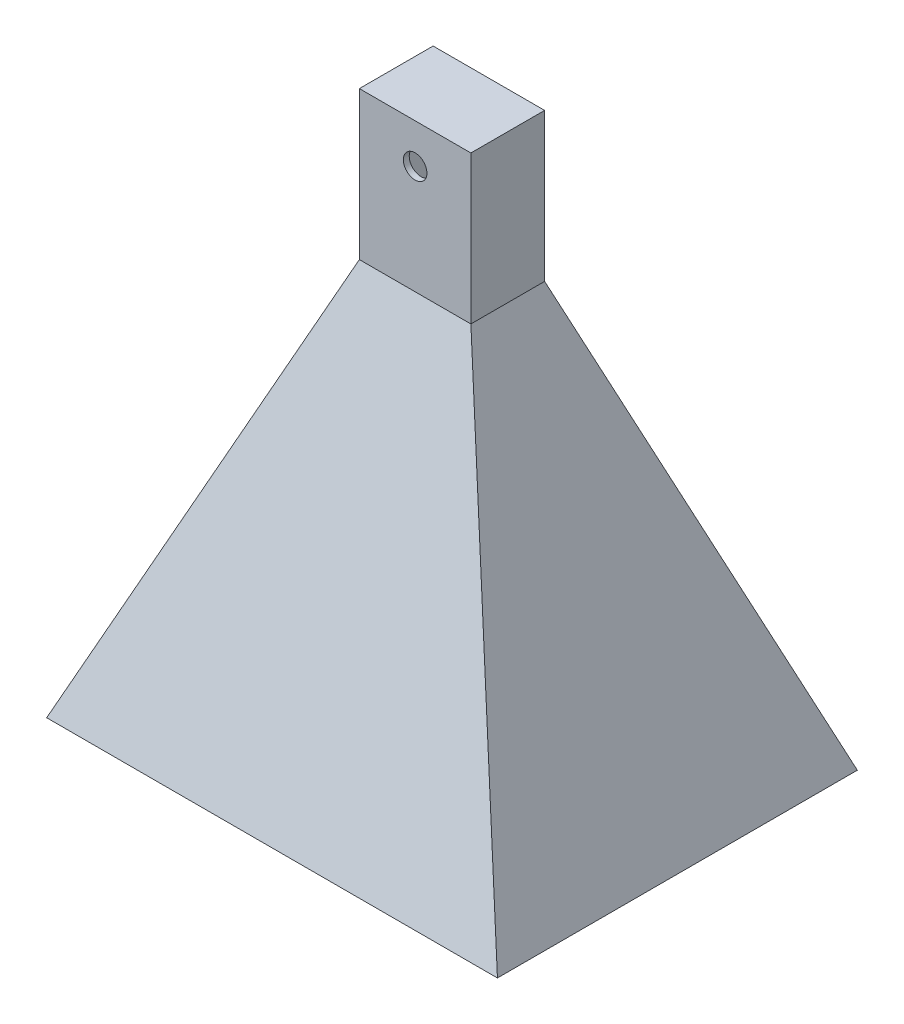
ISO-10303-21;
HEADER;
FILE_DESCRIPTION(('STEP AP214'),'2;1');
FILE_NAME('part.step','',(''),(''),'','','');
FILE_SCHEMA(('AUTOMOTIVE_DESIGN { 1 0 10303 214 1 1 1 1 }'));
ENDSEC;
DATA;
#1=APPLICATION_CONTEXT('core data for automotive mechanical design processes');
#2=APPLICATION_PROTOCOL_DEFINITION('international standard','automotive_design',2000,#1);
#3=PRODUCT_CONTEXT('',#1,'mechanical');
#4=PRODUCT('Part','Part','',(#3));
#5=PRODUCT_RELATED_PRODUCT_CATEGORY('part','',(#4));
#6=PRODUCT_DEFINITION_FORMATION('','',#4);
#7=PRODUCT_DEFINITION_CONTEXT('part definition',#1,'design');
#8=PRODUCT_DEFINITION('design','',#6,#7);
#9=PRODUCT_DEFINITION_SHAPE('','',#8);
#10=(LENGTH_UNIT() NAMED_UNIT(*) SI_UNIT(.MILLI.,.METRE.));
#11=(NAMED_UNIT(*) PLANE_ANGLE_UNIT() SI_UNIT($,.RADIAN.));
#12=(NAMED_UNIT(*) SI_UNIT($,.STERADIAN.) SOLID_ANGLE_UNIT());
#13=UNCERTAINTY_MEASURE_WITH_UNIT(LENGTH_MEASURE(1.E-05),#10,'distance_accuracy_value','');
#14=(GEOMETRIC_REPRESENTATION_CONTEXT(3) GLOBAL_UNCERTAINTY_ASSIGNED_CONTEXT((#13)) GLOBAL_UNIT_ASSIGNED_CONTEXT((#10,
#11,#12)) REPRESENTATION_CONTEXT('',''));
#15=CARTESIAN_POINT('',(0.,0.,0.));
#16=DIRECTION('',(0.,0.,1.));
#17=DIRECTION('',(1.,0.,0.));
#18=AXIS2_PLACEMENT_3D('',#15,#16,#17);
#19=CARTESIAN_POINT('',(0.,695.,0.));
#20=DIRECTION('',(0.,1.,0.));
#21=DIRECTION('',(0.,0.,1.));
#22=AXIS2_PLACEMENT_3D('',#19,#20,#21);
#23=PLANE('',#22);
#24=DIRECTION('',(-1.,0.,0.));
#25=VECTOR('',#24,1.);
#26=CARTESIAN_POINT('',(84.5,695.,52.5000000000001));
#27=LINE('',#26,#25);
#28=CARTESIAN_POINT('',(84.5,695.,52.5000000000001));
#29=VERTEX_POINT('',#28);
#30=CARTESIAN_POINT('',(-84.5,695.,52.5000000000001));
#31=VERTEX_POINT('',#30);
#32=EDGE_CURVE('E267',#29,#31,#27,.T.);
#33=ORIENTED_EDGE('',*,*,#32,.T.);
#34=DIRECTION('',(0.,0.,-1.));
#35=VECTOR('',#34,1.);
#36=CARTESIAN_POINT('',(-84.5,695.,52.5000000000001));
#37=LINE('',#36,#35);
#38=CARTESIAN_POINT('',(-84.5,695.,-52.4999999999999));
#39=VERTEX_POINT('',#38);
#40=EDGE_CURVE('E63',#31,#39,#37,.T.);
#41=ORIENTED_EDGE('',*,*,#40,.T.);
#42=DIRECTION('',(1.,0.,0.));
#43=VECTOR('',#42,1.);
#44=CARTESIAN_POINT('',(-84.5,695.,-52.4999999999999));
#45=LINE('',#44,#43);
#46=CARTESIAN_POINT('',(84.4999999999999,695.,-52.4999999999999));
#47=VERTEX_POINT('',#46);
#48=EDGE_CURVE('E268',#39,#47,#45,.T.);
#49=ORIENTED_EDGE('',*,*,#48,.T.);
#50=DIRECTION('',(0.,0.,1.));
#51=VECTOR('',#50,1.);
#52=CARTESIAN_POINT('',(84.5,695.,-52.4999999999999));
#53=LINE('',#52,#51);
#54=EDGE_CURVE('E265',#47,#29,#53,.T.);
#55=ORIENTED_EDGE('',*,*,#54,.T.);
#56=EDGE_LOOP('',(#33,#41,#49,#55));
#57=FACE_BOUND('',#56,.T.);
#58=DIRECTION('',(1.,0.,0.));
#59=VECTOR('',#58,1.);
#60=CARTESIAN_POINT('',(-94.5,695.,62.5000000000001));
#61=LINE('',#60,#59);
#62=CARTESIAN_POINT('',(-94.5,695.,62.5000000000001));
#63=VERTEX_POINT('',#62);
#64=CARTESIAN_POINT('',(94.5,695.,62.5000000000001));
#65=VERTEX_POINT('',#64);
#66=EDGE_CURVE('E234',#63,#65,#61,.T.);
#67=ORIENTED_EDGE('',*,*,#66,.T.);
#68=DIRECTION('',(0.,0.,-1.));
#69=VECTOR('',#68,1.);
#70=CARTESIAN_POINT('',(94.5,695.,62.5000000000001));
#71=LINE('',#70,#69);
#72=CARTESIAN_POINT('',(94.5,695.,-62.4999999999999));
#73=VERTEX_POINT('',#72);
#74=EDGE_CURVE('E228',#65,#73,#71,.T.);
#75=ORIENTED_EDGE('',*,*,#74,.T.);
#76=DIRECTION('',(-1.,0.,0.));
#77=VECTOR('',#76,1.);
#78=CARTESIAN_POINT('',(94.5,695.,-62.4999999999999));
#79=LINE('',#78,#77);
#80=CARTESIAN_POINT('',(-94.5,695.,-62.4999999999999));
#81=VERTEX_POINT('',#80);
#82=EDGE_CURVE('E69',#73,#81,#79,.T.);
#83=ORIENTED_EDGE('',*,*,#82,.T.);
#84=DIRECTION('',(0.,0.,1.));
#85=VECTOR('',#84,1.);
#86=CARTESIAN_POINT('',(-94.5,695.,-62.4999999999999));
#87=LINE('',#86,#85);
#88=EDGE_CURVE('E13',#81,#63,#87,.T.);
#89=ORIENTED_EDGE('',*,*,#88,.T.);
#90=EDGE_LOOP('',(#67,#75,#83,#89));
#91=FACE_BOUND('',#90,.T.);
#92=ADVANCED_FACE('F59',(#57,#91),#23,.T.);
#93=CARTESIAN_POINT('',(0.,0.,0.));
#94=DIRECTION('',(0.,-1.,0.));
#95=DIRECTION('',(0.,0.,-1.));
#96=AXIS2_PLACEMENT_3D('',#93,#94,#95);
#97=PLANE('',#96);
#98=DIRECTION('',(-1.,0.,0.));
#99=VECTOR('',#98,1.);
#100=CARTESIAN_POINT('',(372.,0.,295.));
#101=LINE('',#100,#99);
#102=CARTESIAN_POINT('',(372.,0.,295.));
#103=VERTEX_POINT('',#102);
#104=CARTESIAN_POINT('',(-372.,0.,295.));
#105=VERTEX_POINT('',#104);
#106=EDGE_CURVE('E138',#103,#105,#101,.T.);
#107=ORIENTED_EDGE('',*,*,#106,.F.);
#108=DIRECTION('',(0.,0.,1.));
#109=VECTOR('',#108,1.);
#110=CARTESIAN_POINT('',(372.,0.,-295.));
#111=LINE('',#110,#109);
#112=CARTESIAN_POINT('',(372.,0.,-295.));
#113=VERTEX_POINT('',#112);
#114=EDGE_CURVE('E144',#113,#103,#111,.T.);
#115=ORIENTED_EDGE('',*,*,#114,.F.);
#116=DIRECTION('',(1.,0.,0.));
#117=VECTOR('',#116,1.);
#118=CARTESIAN_POINT('',(-372.,0.,-295.));
#119=LINE('',#118,#117);
#120=CARTESIAN_POINT('',(-372.,0.,-295.));
#121=VERTEX_POINT('',#120);
#122=EDGE_CURVE('E149',#121,#113,#119,.T.);
#123=ORIENTED_EDGE('',*,*,#122,.F.);
#124=DIRECTION('',(0.,0.,-1.));
#125=VECTOR('',#124,1.);
#126=CARTESIAN_POINT('',(-372.,0.,295.));
#127=LINE('',#126,#125);
#128=EDGE_CURVE('E128',#105,#121,#127,.T.);
#129=ORIENTED_EDGE('',*,*,#128,.F.);
#130=EDGE_LOOP('',(#107,#115,#123,#129));
#131=FACE_BOUND('',#130,.T.);
#132=DIRECTION('',(0.,0.,-1.));
#133=VECTOR('',#132,1.);
#134=CARTESIAN_POINT('',(382.,0.,305.));
#135=LINE('',#134,#133);
#136=CARTESIAN_POINT('',(382.,0.,305.));
#137=VERTEX_POINT('',#136);
#138=CARTESIAN_POINT('',(382.,0.,-305.));
#139=VERTEX_POINT('',#138);
#140=EDGE_CURVE('E320',#137,#139,#135,.T.);
#141=ORIENTED_EDGE('',*,*,#140,.F.);
#142=DIRECTION('',(1.,0.,0.));
#143=VECTOR('',#142,1.);
#144=CARTESIAN_POINT('',(-382.,0.,305.));
#145=LINE('',#144,#143);
#146=CARTESIAN_POINT('',(-382.,0.,305.));
#147=VERTEX_POINT('',#146);
#148=EDGE_CURVE('E350',#147,#137,#145,.T.);
#149=ORIENTED_EDGE('',*,*,#148,.F.);
#150=DIRECTION('',(0.,0.,1.));
#151=VECTOR('',#150,1.);
#152=CARTESIAN_POINT('',(-382.,0.,305.));
#153=LINE('',#152,#151);
#154=CARTESIAN_POINT('',(-382.,0.,-305.));
#155=VERTEX_POINT('',#154);
#156=EDGE_CURVE('E344',#155,#147,#153,.T.);
#157=ORIENTED_EDGE('',*,*,#156,.F.);
#158=DIRECTION('',(-1.,0.,0.));
#159=VECTOR('',#158,1.);
#160=CARTESIAN_POINT('',(-382.,0.,-305.));
#161=LINE('',#160,#159);
#162=EDGE_CURVE('E337',#139,#155,#161,.T.);
#163=ORIENTED_EDGE('',*,*,#162,.F.);
#164=EDGE_LOOP('',(#141,#149,#157,#163));
#165=FACE_BOUND('',#164,.T.);
#166=ADVANCED_FACE('F147',(#131,#165),#97,.T.);
#167=CARTESIAN_POINT('',(0.,94.8707508103307,271.897615724453));
#168=DIRECTION('',(0.,-0.329442570808343,-0.944175615306385));
#169=DIRECTION('',(0.,0.944175615306385,-0.329442570808343));
#170=AXIS2_PLACEMENT_3D('',#167,#168,#169);
#171=PLANE('',#170);
#172=DIRECTION('',(-0.363811124071101,0.879473847754488,-0.306866774216494));
#173=VECTOR('',#172,1.);
#174=CARTESIAN_POINT('',(382.,0.,305.));
#175=LINE('',#174,#173);
#176=EDGE_CURVE('E355',#137,#65,#175,.T.);
#177=ORIENTED_EDGE('',*,*,#176,.T.);
#178=ORIENTED_EDGE('',*,*,#66,.F.);
#179=DIRECTION('',(0.363811124071101,0.879473847754488,-0.306866774216494));
#180=VECTOR('',#179,1.);
#181=CARTESIAN_POINT('',(-382.,0.,305.));
#182=LINE('',#181,#180);
#183=EDGE_CURVE('E363',#147,#63,#182,.T.);
#184=ORIENTED_EDGE('',*,*,#183,.F.);
#185=ORIENTED_EDGE('',*,*,#148,.T.);
#186=EDGE_LOOP('',(#177,#178,#184,#185));
#187=FACE_BOUND('',#186,.T.);
#188=ADVANCED_FACE('F171',(#187),#171,.F.);
#189=CARTESIAN_POINT('',(-326.182898938227,134.931774740634,0.));
#190=DIRECTION('',(0.924057322027841,-0.382253928176985,0.));
#191=DIRECTION('',(0.382253928176985,0.924057322027841,0.));
#192=AXIS2_PLACEMENT_3D('',#189,#190,#191);
#193=PLANE('',#192);
#194=ORIENTED_EDGE('',*,*,#183,.T.);
#195=ORIENTED_EDGE('',*,*,#88,.F.);
#196=DIRECTION('',(0.363811124071101,0.879473847754488,0.306866774216494));
#197=VECTOR('',#196,1.);
#198=CARTESIAN_POINT('',(-382.,0.,-305.));
#199=LINE('',#198,#197);
#200=EDGE_CURVE('E364',#155,#81,#199,.T.);
#201=ORIENTED_EDGE('',*,*,#200,.F.);
#202=ORIENTED_EDGE('',*,*,#156,.T.);
#203=EDGE_LOOP('',(#194,#195,#201,#202));
#204=FACE_BOUND('',#203,.T.);
#205=ADVANCED_FACE('F361',(#204),#193,.F.);
#206=CARTESIAN_POINT('',(326.182898938227,134.931774740634,0.));
#207=DIRECTION('',(-0.924057322027841,-0.382253928176985,0.));
#208=DIRECTION('',(0.382253928176985,-0.924057322027841,0.));
#209=AXIS2_PLACEMENT_3D('',#206,#207,#208);
#210=PLANE('',#209);
#211=DIRECTION('',(-0.363811124071101,0.879473847754488,0.306866774216494));
#212=VECTOR('',#211,1.);
#213=CARTESIAN_POINT('',(382.,0.,-305.));
#214=LINE('',#213,#212);
#215=EDGE_CURVE('E369',#139,#73,#214,.T.);
#216=ORIENTED_EDGE('',*,*,#215,.T.);
#217=ORIENTED_EDGE('',*,*,#74,.F.);
#218=ORIENTED_EDGE('',*,*,#176,.F.);
#219=ORIENTED_EDGE('',*,*,#140,.T.);
#220=EDGE_LOOP('',(#216,#217,#218,#219));
#221=FACE_BOUND('',#220,.T.);
#222=ADVANCED_FACE('F384',(#221),#210,.F.);
#223=CARTESIAN_POINT('',(0.,94.8707508103307,-271.897615724453));
#224=DIRECTION('',(0.,-0.329442570808343,0.944175615306384));
#225=DIRECTION('',(0.,-0.944175615306385,-0.329442570808343));
#226=AXIS2_PLACEMENT_3D('',#223,#224,#225);
#227=PLANE('',#226);
#228=ORIENTED_EDGE('',*,*,#200,.T.);
#229=ORIENTED_EDGE('',*,*,#82,.F.);
#230=ORIENTED_EDGE('',*,*,#215,.F.);
#231=ORIENTED_EDGE('',*,*,#162,.T.);
#232=EDGE_LOOP('',(#228,#229,#230,#231));
#233=FACE_BOUND('',#232,.T.);
#234=ADVANCED_FACE('F392',(#233),#227,.F.);
#235=CARTESIAN_POINT('',(0.,91.7602343903199,262.982939799061));
#236=DIRECTION('',(0.,0.329442570808343,0.944175615306385));
#237=DIRECTION('',(0.,-0.944175615306385,0.329442570808343));
#238=AXIS2_PLACEMENT_3D('',#235,#236,#237);
#239=PLANE('',#238);
#240=DIRECTION('',(-0.363811124071101,0.879473847754488,-0.306866774216494));
#241=VECTOR('',#240,1.);
#242=CARTESIAN_POINT('',(372.,0.,295.));
#243=LINE('',#242,#241);
#244=EDGE_CURVE('E135',#103,#29,#243,.T.);
#245=ORIENTED_EDGE('',*,*,#244,.F.);
#246=ORIENTED_EDGE('',*,*,#106,.T.);
#247=DIRECTION('',(0.363811124071101,0.879473847754488,-0.306866774216494));
#248=VECTOR('',#247,1.);
#249=CARTESIAN_POINT('',(-372.,0.,295.));
#250=LINE('',#249,#248);
#251=EDGE_CURVE('E124',#105,#31,#250,.T.);
#252=ORIENTED_EDGE('',*,*,#251,.T.);
#253=ORIENTED_EDGE('',*,*,#32,.F.);
#254=EDGE_LOOP('',(#245,#246,#252,#253));
#255=FACE_BOUND('',#254,.T.);
#256=ADVANCED_FACE('F139',(#255),#239,.F.);
#257=CARTESIAN_POINT('',(-317.644079594294,131.399529328575,0.));
#258=DIRECTION('',(-0.924057322027841,0.382253928176985,0.));
#259=DIRECTION('',(-0.382253928176985,-0.924057322027841,0.));
#260=AXIS2_PLACEMENT_3D('',#257,#258,#259);
#261=PLANE('',#260);
#262=ORIENTED_EDGE('',*,*,#251,.F.);
#263=ORIENTED_EDGE('',*,*,#128,.T.);
#264=DIRECTION('',(0.363811124071101,0.879473847754488,0.306866774216494));
#265=VECTOR('',#264,1.);
#266=CARTESIAN_POINT('',(-372.,0.,-295.));
#267=LINE('',#266,#265);
#268=EDGE_CURVE('E82',#121,#39,#267,.T.);
#269=ORIENTED_EDGE('',*,*,#268,.T.);
#270=ORIENTED_EDGE('',*,*,#40,.F.);
#271=EDGE_LOOP('',(#262,#263,#269,#270));
#272=FACE_BOUND('',#271,.T.);
#273=ADVANCED_FACE('F126',(#272),#261,.F.);
#274=CARTESIAN_POINT('',(317.644079594295,131.399529328575,0.));
#275=DIRECTION('',(0.924057322027841,0.382253928176985,0.));
#276=DIRECTION('',(-0.382253928176985,0.924057322027841,0.));
#277=AXIS2_PLACEMENT_3D('',#274,#275,#276);
#278=PLANE('',#277);
#279=DIRECTION('',(-0.363811124071101,0.879473847754488,0.306866774216494));
#280=VECTOR('',#279,1.);
#281=CARTESIAN_POINT('',(372.,0.,-295.));
#282=LINE('',#281,#280);
#283=EDGE_CURVE('E77',#113,#47,#282,.T.);
#284=ORIENTED_EDGE('',*,*,#283,.F.);
#285=ORIENTED_EDGE('',*,*,#114,.T.);
#286=ORIENTED_EDGE('',*,*,#244,.T.);
#287=ORIENTED_EDGE('',*,*,#54,.F.);
#288=EDGE_LOOP('',(#284,#285,#286,#287));
#289=FACE_BOUND('',#288,.T.);
#290=ADVANCED_FACE('F290',(#289),#278,.F.);
#291=CARTESIAN_POINT('',(0.,91.7602343903199,-262.982939799061));
#292=DIRECTION('',(0.,0.329442570808343,-0.944175615306384));
#293=DIRECTION('',(0.,0.944175615306385,0.329442570808343));
#294=AXIS2_PLACEMENT_3D('',#291,#292,#293);
#295=PLANE('',#294);
#296=ORIENTED_EDGE('',*,*,#268,.F.);
#297=ORIENTED_EDGE('',*,*,#122,.T.);
#298=ORIENTED_EDGE('',*,*,#283,.T.);
#299=ORIENTED_EDGE('',*,*,#48,.F.);
#300=EDGE_LOOP('',(#296,#297,#298,#299));
#301=FACE_BOUND('',#300,.T.);
#302=ADVANCED_FACE('F172',(#301),#295,.F.);
#303=CLOSED_SHELL('',(#92,#166,#188,#205,#222,#234,#256,#273,#290,#302));
#304=MANIFOLD_SOLID_BREP('B2',#303);
#305=CARTESIAN_POINT('',(84.5,936.,52.5000000000001));
#306=DIRECTION('',(-1.,0.,0.));
#307=DIRECTION('',(0.,0.,1.));
#308=AXIS2_PLACEMENT_3D('',#305,#306,#307);
#309=PLANE('',#308);
#310=DIRECTION('',(0.,-1.,0.));
#311=VECTOR('',#310,1.);
#312=CARTESIAN_POINT('',(84.5,936.,-52.4999999999999));
#313=LINE('',#312,#311);
#314=CARTESIAN_POINT('',(84.5,936.,-52.4999999999999));
#315=VERTEX_POINT('',#314);
#316=CARTESIAN_POINT('',(84.5,695.,-52.4999999999999));
#317=VERTEX_POINT('',#316);
#318=EDGE_CURVE('E592',#315,#317,#313,.T.);
#319=ORIENTED_EDGE('',*,*,#318,.T.);
#320=DIRECTION('',(0.,0.,1.));
#321=VECTOR('',#320,1.);
#322=CARTESIAN_POINT('',(84.5,695.,-52.4999999999999));
#323=LINE('',#322,#321);
#324=CARTESIAN_POINT('',(84.5,695.,52.5000000000001));
#325=VERTEX_POINT('',#324);
#326=EDGE_CURVE('E665',#317,#325,#323,.T.);
#327=ORIENTED_EDGE('',*,*,#326,.T.);
#328=DIRECTION('',(0.,-1.,0.));
#329=VECTOR('',#328,1.);
#330=CARTESIAN_POINT('',(84.5,936.,52.5000000000001));
#331=LINE('',#330,#329);
#332=CARTESIAN_POINT('',(84.5,936.,52.5000000000001));
#333=VERTEX_POINT('',#332);
#334=EDGE_CURVE('E653',#333,#325,#331,.T.);
#335=ORIENTED_EDGE('',*,*,#334,.F.);
#336=DIRECTION('',(0.,0.,-1.));
#337=VECTOR('',#336,1.);
#338=CARTESIAN_POINT('',(84.5,936.,52.5000000000001));
#339=LINE('',#338,#337);
#340=EDGE_CURVE('E675',#333,#315,#339,.T.);
#341=ORIENTED_EDGE('',*,*,#340,.T.);
#342=EDGE_LOOP('',(#319,#327,#335,#341));
#343=FACE_BOUND('',#342,.T.);
#344=ADVANCED_FACE('F577',(#343),#309,.T.);
#345=CARTESIAN_POINT('',(-84.5,936.,-52.4999999999999));
#346=DIRECTION('',(0.,0.,1.));
#347=DIRECTION('',(1.,0.,0.));
#348=AXIS2_PLACEMENT_3D('',#345,#346,#347);
#349=PLANE('',#348);
#350=DIRECTION('',(0.,-1.,0.));
#351=VECTOR('',#350,1.);
#352=CARTESIAN_POINT('',(-84.5,936.,-52.4999999999999));
#353=LINE('',#352,#351);
#354=CARTESIAN_POINT('',(-84.5,936.,-52.4999999999999));
#355=VERTEX_POINT('',#354);
#356=CARTESIAN_POINT('',(-84.5,695.,-52.4999999999999));
#357=VERTEX_POINT('',#356);
#358=EDGE_CURVE('E686',#355,#357,#353,.T.);
#359=ORIENTED_EDGE('',*,*,#358,.T.);
#360=DIRECTION('',(1.,0.,0.));
#361=VECTOR('',#360,1.);
#362=CARTESIAN_POINT('',(-84.5,695.,-52.4999999999999));
#363=LINE('',#362,#361);
#364=EDGE_CURVE('E668',#357,#317,#363,.T.);
#365=ORIENTED_EDGE('',*,*,#364,.T.);
#366=ORIENTED_EDGE('',*,*,#318,.F.);
#367=DIRECTION('',(-1.,0.,0.));
#368=VECTOR('',#367,1.);
#369=CARTESIAN_POINT('',(-84.5,936.,-52.4999999999999));
#370=LINE('',#369,#368);
#371=EDGE_CURVE('E680',#315,#355,#370,.T.);
#372=ORIENTED_EDGE('',*,*,#371,.T.);
#373=EDGE_LOOP('',(#359,#365,#366,#372));
#374=FACE_BOUND('',#373,.T.);
#375=ADVANCED_FACE('F731',(#374),#349,.T.);
#376=CARTESIAN_POINT('',(-84.5,936.,52.5000000000001));
#377=DIRECTION('',(1.,0.,0.));
#378=DIRECTION('',(0.,0.,-1.));
#379=AXIS2_PLACEMENT_3D('',#376,#377,#378);
#380=PLANE('',#379);
#381=DIRECTION('',(0.,-1.,0.));
#382=VECTOR('',#381,1.);
#383=CARTESIAN_POINT('',(-84.5,936.,52.5000000000001));
#384=LINE('',#383,#382);
#385=CARTESIAN_POINT('',(-84.5,936.,52.5000000000001));
#386=VERTEX_POINT('',#385);
#387=CARTESIAN_POINT('',(-84.5,695.,52.5000000000001));
#388=VERTEX_POINT('',#387);
#389=EDGE_CURVE('E662',#386,#388,#384,.T.);
#390=ORIENTED_EDGE('',*,*,#389,.T.);
#391=DIRECTION('',(0.,0.,-1.));
#392=VECTOR('',#391,1.);
#393=CARTESIAN_POINT('',(-84.5,695.,52.5000000000001));
#394=LINE('',#393,#392);
#395=EDGE_CURVE('E673',#388,#357,#394,.T.);
#396=ORIENTED_EDGE('',*,*,#395,.T.);
#397=ORIENTED_EDGE('',*,*,#358,.F.);
#398=DIRECTION('',(0.,0.,1.));
#399=VECTOR('',#398,1.);
#400=CARTESIAN_POINT('',(-84.5,936.,52.5000000000001));
#401=LINE('',#400,#399);
#402=EDGE_CURVE('E682',#355,#386,#401,.T.);
#403=ORIENTED_EDGE('',*,*,#402,.T.);
#404=EDGE_LOOP('',(#390,#396,#397,#403));
#405=FACE_BOUND('',#404,.T.);
#406=ADVANCED_FACE('F736',(#405),#380,.T.);
#407=CARTESIAN_POINT('',(-84.5,936.,52.5000000000001));
#408=DIRECTION('',(0.,0.,-1.));
#409=DIRECTION('',(-1.,0.,0.));
#410=AXIS2_PLACEMENT_3D('',#407,#408,#409);
#411=PLANE('',#410);
#412=CARTESIAN_POINT('',(0.,879.,52.5000000000001));
#413=DIRECTION('',(0.,0.,-1.));
#414=DIRECTION('',(-1.,0.,0.));
#415=AXIS2_PLACEMENT_3D('',#412,#413,#414);
#416=CIRCLE('',#415,20.);
#417=CARTESIAN_POINT('',(-20.,879.,52.5000000000001));
#418=VERTEX_POINT('',#417);
#419=EDGE_CURVE('E764',#418,#418,#416,.T.);
#420=ORIENTED_EDGE('',*,*,#419,.F.);
#421=EDGE_LOOP('',(#420));
#422=FACE_BOUND('',#421,.T.);
#423=ORIENTED_EDGE('',*,*,#334,.T.);
#424=DIRECTION('',(-1.,0.,0.));
#425=VECTOR('',#424,1.);
#426=CARTESIAN_POINT('',(84.5,695.,52.5000000000001));
#427=LINE('',#426,#425);
#428=EDGE_CURVE('E657',#325,#388,#427,.T.);
#429=ORIENTED_EDGE('',*,*,#428,.T.);
#430=ORIENTED_EDGE('',*,*,#389,.F.);
#431=DIRECTION('',(1.,0.,0.));
#432=VECTOR('',#431,1.);
#433=CARTESIAN_POINT('',(-84.5,936.,52.5000000000001));
#434=LINE('',#433,#432);
#435=EDGE_CURVE('E660',#386,#333,#434,.T.);
#436=ORIENTED_EDGE('',*,*,#435,.T.);
#437=EDGE_LOOP('',(#423,#429,#430,#436));
#438=FACE_BOUND('',#437,.T.);
#439=ADVANCED_FACE('F654',(#422,#438),#411,.T.);
#440=CARTESIAN_POINT('',(0.,936.,0.));
#441=DIRECTION('',(0.,1.,0.));
#442=DIRECTION('',(0.,0.,1.));
#443=AXIS2_PLACEMENT_3D('',#440,#441,#442);
#444=PLANE('',#443);
#445=ORIENTED_EDGE('',*,*,#340,.F.);
#446=ORIENTED_EDGE('',*,*,#435,.F.);
#447=ORIENTED_EDGE('',*,*,#402,.F.);
#448=ORIENTED_EDGE('',*,*,#371,.F.);
#449=EDGE_LOOP('',(#445,#446,#447,#448));
#450=FACE_BOUND('',#449,.T.);
#451=ADVANCED_FACE('F752',(#450),#444,.F.);
#452=CARTESIAN_POINT('',(94.5,946.,0.));
#453=DIRECTION('',(-1.,0.,0.));
#454=DIRECTION('',(0.,0.,1.));
#455=AXIS2_PLACEMENT_3D('',#452,#453,#454);
#456=PLANE('',#455);
#457=DIRECTION('',(0.,0.,-1.));
#458=VECTOR('',#457,1.);
#459=CARTESIAN_POINT('',(94.5,695.,0.));
#460=LINE('',#459,#458);
#461=CARTESIAN_POINT('',(94.5,695.,62.5000000000001));
#462=VERTEX_POINT('',#461);
#463=CARTESIAN_POINT('',(94.5,695.,-62.4999999999999));
#464=VERTEX_POINT('',#463);
#465=EDGE_CURVE('E689',#462,#464,#460,.T.);
#466=ORIENTED_EDGE('',*,*,#465,.T.);
#467=DIRECTION('',(0.,-1.,0.));
#468=VECTOR('',#467,1.);
#469=CARTESIAN_POINT('',(94.5,946.,-62.4999999999999));
#470=LINE('',#469,#468);
#471=CARTESIAN_POINT('',(94.5,946.,-62.4999999999999));
#472=VERTEX_POINT('',#471);
#473=EDGE_CURVE('E57',#472,#464,#470,.T.);
#474=ORIENTED_EDGE('',*,*,#473,.F.);
#475=DIRECTION('',(0.,0.,-1.));
#476=VECTOR('',#475,1.);
#477=CARTESIAN_POINT('',(94.5,946.,0.));
#478=LINE('',#477,#476);
#479=CARTESIAN_POINT('',(94.5,946.,62.5000000000001));
#480=VERTEX_POINT('',#479);
#481=EDGE_CURVE('E690',#480,#472,#478,.T.);
#482=ORIENTED_EDGE('',*,*,#481,.F.);
#483=DIRECTION('',(0.,-1.,0.));
#484=VECTOR('',#483,1.);
#485=CARTESIAN_POINT('',(94.5,946.,62.5000000000001));
#486=LINE('',#485,#484);
#487=EDGE_CURVE('E696',#480,#462,#486,.T.);
#488=ORIENTED_EDGE('',*,*,#487,.T.);
#489=EDGE_LOOP('',(#466,#474,#482,#488));
#490=FACE_BOUND('',#489,.T.);
#491=ADVANCED_FACE('F579',(#490),#456,.F.);
#492=CARTESIAN_POINT('',(0.,946.,-62.4999999999999));
#493=DIRECTION('',(0.,0.,1.));
#494=DIRECTION('',(1.,0.,0.));
#495=AXIS2_PLACEMENT_3D('',#492,#493,#494);
#496=PLANE('',#495);
#497=DIRECTION('',(-1.,0.,0.));
#498=VECTOR('',#497,1.);
#499=CARTESIAN_POINT('',(0.,695.,-62.4999999999999));
#500=LINE('',#499,#498);
#501=CARTESIAN_POINT('',(-94.5,695.,-62.4999999999999));
#502=VERTEX_POINT('',#501);
#503=EDGE_CURVE('E699',#464,#502,#500,.T.);
#504=ORIENTED_EDGE('',*,*,#503,.T.);
#505=DIRECTION('',(0.,-1.,0.));
#506=VECTOR('',#505,1.);
#507=CARTESIAN_POINT('',(-94.5,946.,-62.4999999999999));
#508=LINE('',#507,#506);
#509=CARTESIAN_POINT('',(-94.5,946.,-62.4999999999999));
#510=VERTEX_POINT('',#509);
#511=EDGE_CURVE('E585',#510,#502,#508,.T.);
#512=ORIENTED_EDGE('',*,*,#511,.F.);
#513=DIRECTION('',(-1.,0.,0.));
#514=VECTOR('',#513,1.);
#515=CARTESIAN_POINT('',(0.,946.,-62.4999999999999));
#516=LINE('',#515,#514);
#517=EDGE_CURVE('E629',#472,#510,#516,.T.);
#518=ORIENTED_EDGE('',*,*,#517,.F.);
#519=ORIENTED_EDGE('',*,*,#473,.T.);
#520=EDGE_LOOP('',(#504,#512,#518,#519));
#521=FACE_BOUND('',#520,.T.);
#522=ADVANCED_FACE('F726',(#521),#496,.F.);
#523=CARTESIAN_POINT('',(-94.5,946.,0.));
#524=DIRECTION('',(1.,0.,0.));
#525=DIRECTION('',(0.,0.,-1.));
#526=AXIS2_PLACEMENT_3D('',#523,#524,#525);
#527=PLANE('',#526);
#528=DIRECTION('',(0.,0.,1.));
#529=VECTOR('',#528,1.);
#530=CARTESIAN_POINT('',(-94.5,695.,0.));
#531=LINE('',#530,#529);
#532=CARTESIAN_POINT('',(-94.5,695.,62.5000000000001));
#533=VERTEX_POINT('',#532);
#534=EDGE_CURVE('E701',#502,#533,#531,.T.);
#535=ORIENTED_EDGE('',*,*,#534,.T.);
#536=DIRECTION('',(0.,-1.,0.));
#537=VECTOR('',#536,1.);
#538=CARTESIAN_POINT('',(-94.5,946.,62.5000000000001));
#539=LINE('',#538,#537);
#540=CARTESIAN_POINT('',(-94.5,946.,62.5000000000001));
#541=VERTEX_POINT('',#540);
#542=EDGE_CURVE('E705',#541,#533,#539,.T.);
#543=ORIENTED_EDGE('',*,*,#542,.F.);
#544=DIRECTION('',(0.,0.,1.));
#545=VECTOR('',#544,1.);
#546=CARTESIAN_POINT('',(-94.5,946.,0.));
#547=LINE('',#546,#545);
#548=EDGE_CURVE('E693',#510,#541,#547,.T.);
#549=ORIENTED_EDGE('',*,*,#548,.F.);
#550=ORIENTED_EDGE('',*,*,#511,.T.);
#551=EDGE_LOOP('',(#535,#543,#549,#550));
#552=FACE_BOUND('',#551,.T.);
#553=ADVANCED_FACE('F710',(#552),#527,.F.);
#554=CARTESIAN_POINT('',(0.,946.,62.5000000000001));
#555=DIRECTION('',(0.,0.,-1.));
#556=DIRECTION('',(-1.,0.,0.));
#557=AXIS2_PLACEMENT_3D('',#554,#555,#556);
#558=PLANE('',#557);
#559=CARTESIAN_POINT('',(0.,879.,62.5000000000001));
#560=DIRECTION('',(0.,0.,1.));
#561=DIRECTION('',(1.,0.,0.));
#562=AXIS2_PLACEMENT_3D('',#559,#560,#561);
#563=CIRCLE('',#562,20.);
#564=CARTESIAN_POINT('',(20.,879.,62.5000000000001));
#565=VERTEX_POINT('',#564);
#566=EDGE_CURVE('E765',#565,#565,#563,.T.);
#567=ORIENTED_EDGE('',*,*,#566,.F.);
#568=EDGE_LOOP('',(#567));
#569=FACE_BOUND('',#568,.T.);
#570=DIRECTION('',(1.,0.,0.));
#571=VECTOR('',#570,1.);
#572=CARTESIAN_POINT('',(0.,695.,62.5000000000001));
#573=LINE('',#572,#571);
#574=EDGE_CURVE('E622',#533,#462,#573,.T.);
#575=ORIENTED_EDGE('',*,*,#574,.T.);
#576=ORIENTED_EDGE('',*,*,#487,.F.);
#577=DIRECTION('',(1.,0.,0.));
#578=VECTOR('',#577,1.);
#579=CARTESIAN_POINT('',(0.,946.,62.5000000000001));
#580=LINE('',#579,#578);
#581=EDGE_CURVE('E601',#541,#480,#580,.T.);
#582=ORIENTED_EDGE('',*,*,#581,.F.);
#583=ORIENTED_EDGE('',*,*,#542,.T.);
#584=EDGE_LOOP('',(#575,#576,#582,#583));
#585=FACE_BOUND('',#584,.T.);
#586=ADVANCED_FACE('F716',(#569,#585),#558,.F.);
#587=CARTESIAN_POINT('',(0.,946.,0.));
#588=DIRECTION('',(0.,1.,0.));
#589=DIRECTION('',(0.,0.,1.));
#590=AXIS2_PLACEMENT_3D('',#587,#588,#589);
#591=PLANE('',#590);
#592=ORIENTED_EDGE('',*,*,#481,.T.);
#593=ORIENTED_EDGE('',*,*,#517,.T.);
#594=ORIENTED_EDGE('',*,*,#548,.T.);
#595=ORIENTED_EDGE('',*,*,#581,.T.);
#596=EDGE_LOOP('',(#592,#593,#594,#595));
#597=FACE_BOUND('',#596,.T.);
#598=ADVANCED_FACE('F718',(#597),#591,.T.);
#599=CARTESIAN_POINT('',(0.,695.,0.));
#600=DIRECTION('',(0.,1.,0.));
#601=DIRECTION('',(0.,0.,1.));
#602=AXIS2_PLACEMENT_3D('',#599,#600,#601);
#603=PLANE('',#602);
#604=ORIENTED_EDGE('',*,*,#326,.F.);
#605=ORIENTED_EDGE('',*,*,#364,.F.);
#606=ORIENTED_EDGE('',*,*,#395,.F.);
#607=ORIENTED_EDGE('',*,*,#428,.F.);
#608=EDGE_LOOP('',(#604,#605,#606,#607));
#609=FACE_BOUND('',#608,.T.);
#610=ORIENTED_EDGE('',*,*,#465,.F.);
#611=ORIENTED_EDGE('',*,*,#574,.F.);
#612=ORIENTED_EDGE('',*,*,#534,.F.);
#613=ORIENTED_EDGE('',*,*,#503,.F.);
#614=EDGE_LOOP('',(#610,#611,#612,#613));
#615=FACE_BOUND('',#614,.T.);
#616=ADVANCED_FACE('F670',(#609,#615),#603,.F.);
#617=CARTESIAN_POINT('',(0.,879.,9.50000000000006));
#618=DIRECTION('',(0.,0.,1.));
#619=DIRECTION('',(1.,0.,0.));
#620=AXIS2_PLACEMENT_3D('',#617,#618,#619);
#621=CYLINDRICAL_SURFACE('',#620,20.);
#622=ORIENTED_EDGE('',*,*,#419,.T.);
#623=EDGE_LOOP('',(#622));
#624=FACE_BOUND('',#623,.T.);
#625=ORIENTED_EDGE('',*,*,#566,.T.);
#626=EDGE_LOOP('',(#625));
#627=FACE_BOUND('',#626,.T.);
#628=ADVANCED_FACE('F741',(#624,#627),#621,.F.);
#629=CLOSED_SHELL('',(#344,#375,#406,#439,#451,#491,#522,#553,#586,#598,#616,#628));
#630=MANIFOLD_SOLID_BREP('B7',#629);
#631=ADVANCED_BREP_SHAPE_REPRESENTATION('',(#18,#304,#630),#14);
#632=SHAPE_DEFINITION_REPRESENTATION(#9,#631);
ENDSEC;
END-ISO-10303-21;
